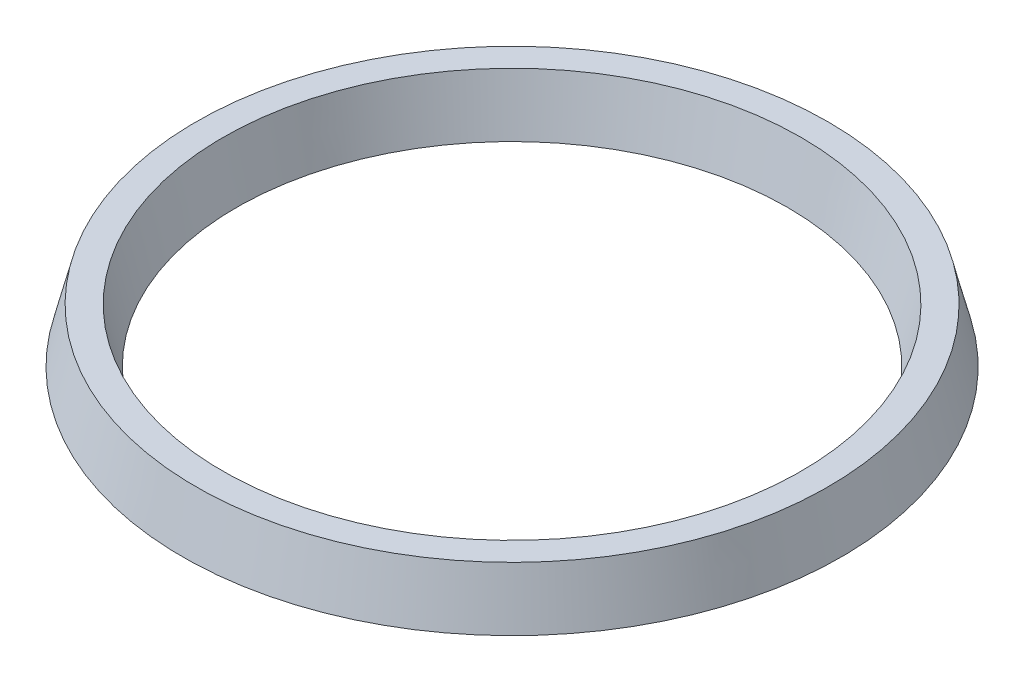
ISO-10303-21;
HEADER;
FILE_DESCRIPTION(('STEP AP214'),'2;1');
FILE_NAME('part.step','',(''),(''),'','','');
FILE_SCHEMA(('AUTOMOTIVE_DESIGN { 1 0 10303 214 1 1 1 1 }'));
ENDSEC;
DATA;
#1=APPLICATION_CONTEXT('core data for automotive mechanical design processes');
#2=APPLICATION_PROTOCOL_DEFINITION('international standard','automotive_design',2000,#1);
#3=PRODUCT_CONTEXT('',#1,'mechanical');
#4=PRODUCT('Part','Part','',(#3));
#5=PRODUCT_RELATED_PRODUCT_CATEGORY('part','',(#4));
#6=PRODUCT_DEFINITION_FORMATION('','',#4);
#7=PRODUCT_DEFINITION_CONTEXT('part definition',#1,'design');
#8=PRODUCT_DEFINITION('design','',#6,#7);
#9=PRODUCT_DEFINITION_SHAPE('','',#8);
#10=(LENGTH_UNIT() NAMED_UNIT(*) SI_UNIT(.MILLI.,.METRE.));
#11=(NAMED_UNIT(*) PLANE_ANGLE_UNIT() SI_UNIT($,.RADIAN.));
#12=(NAMED_UNIT(*) SI_UNIT($,.STERADIAN.) SOLID_ANGLE_UNIT());
#13=UNCERTAINTY_MEASURE_WITH_UNIT(LENGTH_MEASURE(1.E-05),#10,'distance_accuracy_value','');
#14=(GEOMETRIC_REPRESENTATION_CONTEXT(3) GLOBAL_UNCERTAINTY_ASSIGNED_CONTEXT((#13)) GLOBAL_UNIT_ASSIGNED_CONTEXT((#10,
#11,#12)) REPRESENTATION_CONTEXT('',''));
#15=CARTESIAN_POINT('',(0.,0.,0.));
#16=DIRECTION('',(0.,0.,1.));
#17=DIRECTION('',(1.,0.,0.));
#18=AXIS2_PLACEMENT_3D('',#15,#16,#17);
#19=CARTESIAN_POINT('',(-67.6106424203183,-12.,0.));
#20=DIRECTION('',(0.,1.,0.));
#21=DIRECTION('',(0.,0.,1.));
#22=AXIS2_PLACEMENT_3D('',#19,#20,#21);
#23=CONICAL_SURFACE('',#22,64.31,0.244978663126864);
#24=CARTESIAN_POINT('',(-67.6106424203183,-7.455213750218,0.));
#25=DIRECTION('',(0.,-1.,0.));
#26=DIRECTION('',(0.,0.,-1.));
#27=AXIS2_PLACEMENT_3D('',#24,#25,#26);
#28=CIRCLE('',#27,65.4461965624455);
#29=CARTESIAN_POINT('',(-67.6106424203183,-7.455213750218,-65.4461965624455));
#30=VERTEX_POINT('',#29);
#31=EDGE_CURVE('E10',#30,#30,#28,.T.);
#32=ORIENTED_EDGE('',*,*,#31,.T.);
#33=EDGE_LOOP('',(#32));
#34=FACE_BOUND('',#33,.T.);
#35=CARTESIAN_POINT('',(-67.6106424203183,-12.,0.));
#36=DIRECTION('',(0.,-1.,0.));
#37=DIRECTION('',(0.,0.,-1.));
#38=AXIS2_PLACEMENT_3D('',#35,#36,#37);
#39=CIRCLE('',#38,64.31);
#40=CARTESIAN_POINT('',(-67.6106424203183,-12.,-64.31));
#41=VERTEX_POINT('',#40);
#42=EDGE_CURVE('E61',#41,#41,#39,.T.);
#43=ORIENTED_EDGE('',*,*,#42,.F.);
#44=EDGE_LOOP('',(#43));
#45=FACE_BOUND('',#44,.T.);
#46=ADVANCED_FACE('F33',(#34,#45),#23,.T.);
#47=CARTESIAN_POINT('',(-67.6106424203183,-7.92116460960662,0.));
#48=DIRECTION('',(0.,-1.,0.));
#49=DIRECTION('',(0.,0.,-1.));
#50=AXIS2_PLACEMENT_3D('',#47,#48,#49);
#51=TOROIDAL_SURFACE('',#50,67.31,1.92116460960662);
#52=CARTESIAN_POINT('',(-67.6106424203183,-7.455213750218,0.));
#53=DIRECTION('',(0.,-1.,0.));
#54=DIRECTION('',(0.,0.,-1.));
#55=AXIS2_PLACEMENT_3D('',#52,#53,#54);
#56=CIRCLE('',#55,69.1738034375545);
#57=CARTESIAN_POINT('',(-67.6106424203183,-7.455213750218,-69.1738034375545));
#58=VERTEX_POINT('',#57);
#59=EDGE_CURVE('E39',#58,#58,#56,.T.);
#60=ORIENTED_EDGE('',*,*,#59,.T.);
#61=EDGE_LOOP('',(#60));
#62=FACE_BOUND('',#61,.T.);
#63=ORIENTED_EDGE('',*,*,#31,.F.);
#64=EDGE_LOOP('',(#63));
#65=FACE_BOUND('',#64,.T.);
#66=ADVANCED_FACE('F69',(#62,#65),#51,.F.);
#67=CARTESIAN_POINT('',(-67.6106424203183,-12.,0.));
#68=DIRECTION('',(0.,-1.,0.));
#69=DIRECTION('',(0.,0.,-1.));
#70=AXIS2_PLACEMENT_3D('',#67,#68,#69);
#71=CONICAL_SURFACE('',#70,70.31,0.244978663126864);
#72=ORIENTED_EDGE('',*,*,#59,.F.);
#73=EDGE_LOOP('',(#72));
#74=FACE_BOUND('',#73,.T.);
#75=CARTESIAN_POINT('',(-67.6106424203183,-12.,0.));
#76=DIRECTION('',(0.,-1.,0.));
#77=DIRECTION('',(0.,0.,-1.));
#78=AXIS2_PLACEMENT_3D('',#75,#76,#77);
#79=CIRCLE('',#78,70.31);
#80=CARTESIAN_POINT('',(-67.6106424203183,-12.,-70.31));
#81=VERTEX_POINT('',#80);
#82=EDGE_CURVE('E43',#81,#81,#79,.T.);
#83=ORIENTED_EDGE('',*,*,#82,.T.);
#84=EDGE_LOOP('',(#83));
#85=FACE_BOUND('',#84,.T.);
#86=ADVANCED_FACE('F73',(#74,#85),#71,.F.);
#87=CARTESIAN_POINT('',(0.,-12.,0.));
#88=DIRECTION('',(0.,-1.,0.));
#89=DIRECTION('',(0.,0.,-1.));
#90=AXIS2_PLACEMENT_3D('',#87,#88,#89);
#91=PLANE('',#90);
#92=CARTESIAN_POINT('',(-67.6106424203183,-12.,0.));
#93=DIRECTION('',(0.,-1.,0.));
#94=DIRECTION('',(0.,0.,-1.));
#95=AXIS2_PLACEMENT_3D('',#92,#93,#94);
#96=CIRCLE('',#95,73.31);
#97=CARTESIAN_POINT('',(-67.6106424203183,-12.,-73.31));
#98=VERTEX_POINT('',#97);
#99=EDGE_CURVE('E47',#98,#98,#96,.T.);
#100=ORIENTED_EDGE('',*,*,#99,.T.);
#101=EDGE_LOOP('',(#100));
#102=FACE_BOUND('',#101,.T.);
#103=ORIENTED_EDGE('',*,*,#82,.F.);
#104=EDGE_LOOP('',(#103));
#105=FACE_BOUND('',#104,.T.);
#106=ADVANCED_FACE('F77',(#102,#105),#91,.T.);
#107=CARTESIAN_POINT('',(-67.6106424203183,-12.,0.));
#108=DIRECTION('',(0.,-1.,0.));
#109=DIRECTION('',(0.,0.,-1.));
#110=AXIS2_PLACEMENT_3D('',#107,#108,#109);
#111=CONICAL_SURFACE('',#110,73.31,0.244978663126864);
#112=CARTESIAN_POINT('',(-67.6106424203183,0.,0.));
#113=DIRECTION('',(0.,-1.,0.));
#114=DIRECTION('',(0.,0.,-1.));
#115=AXIS2_PLACEMENT_3D('',#112,#113,#114);
#116=CIRCLE('',#115,70.31);
#117=CARTESIAN_POINT('',(-67.6106424203183,0.,-70.31));
#118=VERTEX_POINT('',#117);
#119=EDGE_CURVE('E52',#118,#118,#116,.T.);
#120=ORIENTED_EDGE('',*,*,#119,.T.);
#121=EDGE_LOOP('',(#120));
#122=FACE_BOUND('',#121,.T.);
#123=ORIENTED_EDGE('',*,*,#99,.F.);
#124=EDGE_LOOP('',(#123));
#125=FACE_BOUND('',#124,.T.);
#126=ADVANCED_FACE('F84',(#122,#125),#111,.T.);
#127=CARTESIAN_POINT('',(0.,0.,0.));
#128=DIRECTION('',(0.,-1.,0.));
#129=DIRECTION('',(0.,0.,-1.));
#130=AXIS2_PLACEMENT_3D('',#127,#128,#129);
#131=PLANE('',#130);
#132=ORIENTED_EDGE('',*,*,#119,.F.);
#133=EDGE_LOOP('',(#132));
#134=FACE_BOUND('',#133,.T.);
#135=CARTESIAN_POINT('',(-67.6106424203183,0.,0.));
#136=DIRECTION('',(0.,-1.,0.));
#137=DIRECTION('',(0.,0.,-1.));
#138=AXIS2_PLACEMENT_3D('',#135,#136,#137);
#139=CIRCLE('',#138,64.31);
#140=CARTESIAN_POINT('',(-67.6106424203183,0.,-64.31));
#141=VERTEX_POINT('',#140);
#142=EDGE_CURVE('E55',#141,#141,#139,.T.);
#143=ORIENTED_EDGE('',*,*,#142,.T.);
#144=EDGE_LOOP('',(#143));
#145=FACE_BOUND('',#144,.T.);
#146=ADVANCED_FACE('F88',(#134,#145),#131,.F.);
#147=CARTESIAN_POINT('',(-67.6106424203183,0.,0.));
#148=DIRECTION('',(0.,1.,0.));
#149=DIRECTION('',(0.,0.,1.));
#150=AXIS2_PLACEMENT_3D('',#147,#148,#149);
#151=CONICAL_SURFACE('',#150,64.31,0.244978663126864);
#152=CARTESIAN_POINT('',(-67.6106424203183,-12.,0.));
#153=DIRECTION('',(0.,-1.,0.));
#154=DIRECTION('',(0.,0.,-1.));
#155=AXIS2_PLACEMENT_3D('',#152,#153,#154);
#156=CIRCLE('',#155,61.31);
#157=CARTESIAN_POINT('',(-67.6106424203183,-12.,-61.31));
#158=VERTEX_POINT('',#157);
#159=EDGE_CURVE('E58',#158,#158,#156,.T.);
#160=ORIENTED_EDGE('',*,*,#159,.T.);
#161=EDGE_LOOP('',(#160));
#162=FACE_BOUND('',#161,.T.);
#163=ORIENTED_EDGE('',*,*,#142,.F.);
#164=EDGE_LOOP('',(#163));
#165=FACE_BOUND('',#164,.T.);
#166=ADVANCED_FACE('F92',(#162,#165),#151,.F.);
#167=CARTESIAN_POINT('',(0.,-12.,0.));
#168=DIRECTION('',(0.,-1.,0.));
#169=DIRECTION('',(0.,0.,-1.));
#170=AXIS2_PLACEMENT_3D('',#167,#168,#169);
#171=PLANE('',#170);
#172=ORIENTED_EDGE('',*,*,#42,.T.);
#173=EDGE_LOOP('',(#172));
#174=FACE_BOUND('',#173,.T.);
#175=ORIENTED_EDGE('',*,*,#159,.F.);
#176=EDGE_LOOP('',(#175));
#177=FACE_BOUND('',#176,.T.);
#178=ADVANCED_FACE('F65',(#174,#177),#171,.T.);
#179=CLOSED_SHELL('',(#46,#66,#86,#106,#126,#146,#166,#178));
#180=MANIFOLD_SOLID_BREP('B2',#179);
#181=ADVANCED_BREP_SHAPE_REPRESENTATION('',(#18,#180),#14);
#182=SHAPE_DEFINITION_REPRESENTATION(#9,#181);
ENDSEC;
END-ISO-10303-21;
